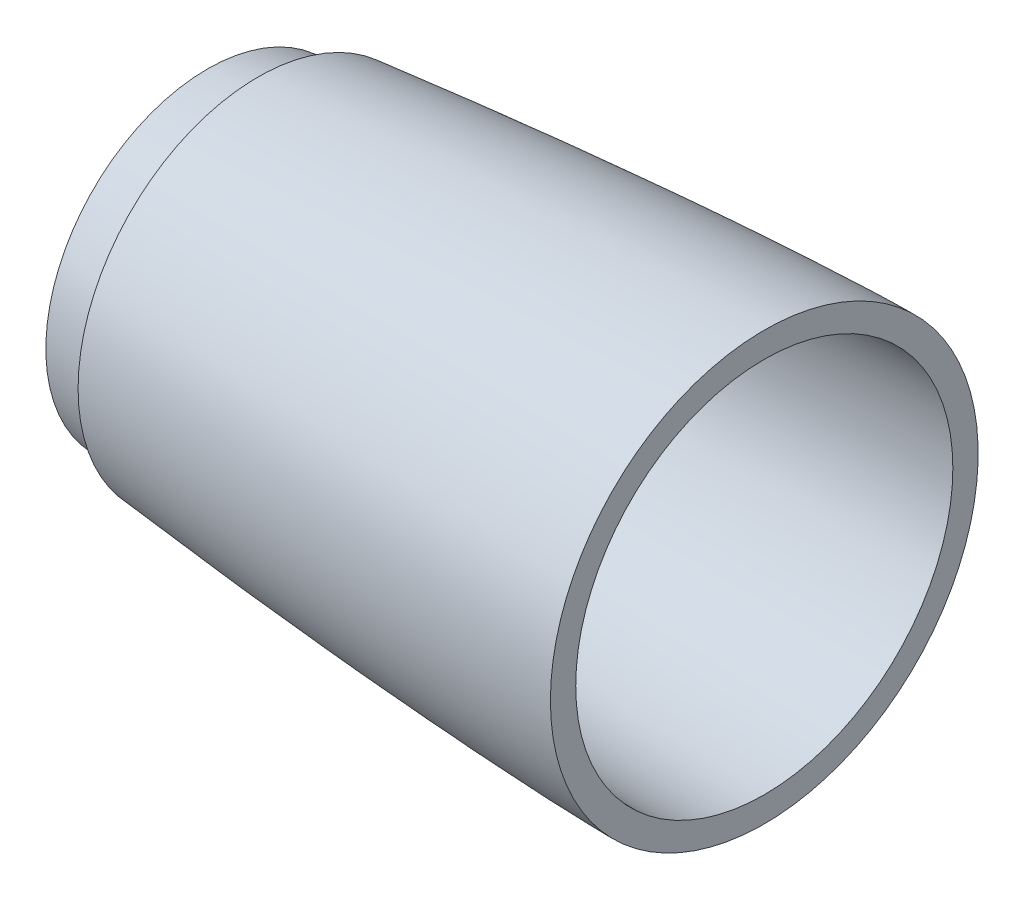
ISO-10303-21;
HEADER;
FILE_DESCRIPTION(('STEP AP214'),'2;1');
FILE_NAME('part.step','',(''),(''),'','','');
FILE_SCHEMA(('AUTOMOTIVE_DESIGN { 1 0 10303 214 1 1 1 1 }'));
ENDSEC;
DATA;
#1=APPLICATION_CONTEXT('core data for automotive mechanical design processes');
#2=APPLICATION_PROTOCOL_DEFINITION('international standard','automotive_design',2000,#1);
#3=PRODUCT_CONTEXT('',#1,'mechanical');
#4=PRODUCT('Part','Part','',(#3));
#5=PRODUCT_RELATED_PRODUCT_CATEGORY('part','',(#4));
#6=PRODUCT_DEFINITION_FORMATION('','',#4);
#7=PRODUCT_DEFINITION_CONTEXT('part definition',#1,'design');
#8=PRODUCT_DEFINITION('design','',#6,#7);
#9=PRODUCT_DEFINITION_SHAPE('','',#8);
#10=(LENGTH_UNIT() NAMED_UNIT(*) SI_UNIT(.MILLI.,.METRE.));
#11=(NAMED_UNIT(*) PLANE_ANGLE_UNIT() SI_UNIT($,.RADIAN.));
#12=(NAMED_UNIT(*) SI_UNIT($,.STERADIAN.) SOLID_ANGLE_UNIT());
#13=UNCERTAINTY_MEASURE_WITH_UNIT(LENGTH_MEASURE(1.E-05),#10,'distance_accuracy_value','');
#14=(GEOMETRIC_REPRESENTATION_CONTEXT(3) GLOBAL_UNCERTAINTY_ASSIGNED_CONTEXT((#13)) GLOBAL_UNIT_ASSIGNED_CONTEXT((#10,
#11,#12)) REPRESENTATION_CONTEXT('',''));
#15=CARTESIAN_POINT('',(0.,0.,0.));
#16=DIRECTION('',(0.,0.,1.));
#17=DIRECTION('',(1.,0.,0.));
#18=AXIS2_PLACEMENT_3D('',#15,#16,#17);
#19=CARTESIAN_POINT('',(379.999999999681,0.,-58.0833991942148));
#20=DIRECTION('',(1.,0.,0.));
#21=DIRECTION('',(0.,0.,-1.));
#22=AXIS2_PLACEMENT_3D('',#19,#20,#21);
#23=PLANE('',#22);
#24=CARTESIAN_POINT('',(380.000000004945,0.,0.964537705785209));
#25=DIRECTION('',(1.,0.,0.));
#26=DIRECTION('',(0.,1.,0.));
#27=AXIS2_PLACEMENT_3D('',#24,#25,#26);
#28=CIRCLE('',#27,63.8479368534603);
#29=CARTESIAN_POINT('',(380.000000004945,63.8479368534603,0.964537705785209));
#30=VERTEX_POINT('',#29);
#31=EDGE_CURVE('E18',#30,#30,#28,.T.);
#32=ORIENTED_EDGE('',*,*,#31,.F.);
#33=EDGE_LOOP('',(#32));
#34=FACE_BOUND('',#33,.T.);
#35=CARTESIAN_POINT('',(379.999999999681,0.,0.964537705785209));
#36=DIRECTION('',(-1.,0.,0.));
#37=DIRECTION('',(0.,0.,1.));
#38=AXIS2_PLACEMENT_3D('',#35,#36,#37);
#39=CIRCLE('',#38,59.0479369);
#40=CARTESIAN_POINT('',(379.999999999681,0.,60.0124746057852));
#41=VERTEX_POINT('',#40);
#42=EDGE_CURVE('E39',#41,#41,#39,.F.);
#43=ORIENTED_EDGE('',*,*,#42,.T.);
#44=EDGE_LOOP('',(#43));
#45=FACE_BOUND('',#44,.T.);
#46=ADVANCED_FACE('F15',(#34,#45),#23,.F.);
#47=CARTESIAN_POINT('',(400.000000006089,0.,0.964537705785209));
#48=DIRECTION('',(1.,0.,0.));
#49=DIRECTION('',(0.,1.,0.));
#50=AXIS2_PLACEMENT_3D('',#47,#48,#49);
#51=CONICAL_SURFACE('',#50,66.1099973006079,0.1126244082);
#52=CARTESIAN_POINT('',(400.000000006089,0.,0.964537705785209));
#53=DIRECTION('',(1.,0.,0.));
#54=DIRECTION('',(0.,1.,0.));
#55=AXIS2_PLACEMENT_3D('',#52,#53,#54);
#56=CIRCLE('',#55,66.1099973006079);
#57=CARTESIAN_POINT('',(400.000000006089,66.1099973006079,0.964537705785209));
#58=VERTEX_POINT('',#57);
#59=EDGE_CURVE('E37',#58,#58,#56,.F.);
#60=ORIENTED_EDGE('',*,*,#59,.T.);
#61=EDGE_LOOP('',(#60));
#62=FACE_BOUND('',#61,.T.);
#63=ORIENTED_EDGE('',*,*,#31,.T.);
#64=EDGE_LOOP('',(#63));
#65=FACE_BOUND('',#64,.T.);
#66=ADVANCED_FACE('F46',(#62,#65),#51,.T.);
#67=CARTESIAN_POINT('',(379.999999999677,0.,-58.0833991942144));
#68=CARTESIAN_POINT('',(381.491572893679,0.,-58.2411280340743));
#69=CARTESIAN_POINT('',(384.504502535526,0.,-58.5578486347942));
#70=CARTESIAN_POINT('',(390.180207109146,0.,-59.1495332991518));
#71=CARTESIAN_POINT('',(396.233334180423,0.,-59.7668903276334));
#72=CARTESIAN_POINT('',(404.723807289305,0.,-60.6219573858539));
#73=CARTESIAN_POINT('',(412.728600218223,0.,-61.4063968825873));
#74=CARTESIAN_POINT('',(421.060003576404,0.,-62.2058637503101));
#75=CARTESIAN_POINT('',(429.20089670457,0.,-62.965362550788));
#76=CARTESIAN_POINT('',(435.802578164731,0.,-63.5703357102628));
#77=CARTESIAN_POINT('',(443.995135831561,0.,-64.3050176574283));
#78=CARTESIAN_POINT('',(453.862494729702,0.,-65.1657429619435));
#79=CARTESIAN_POINT('',(465.356434621266,0.,-66.1311088791061));
#80=CARTESIAN_POINT('',(478.509650312228,0.,-67.1836844487914));
#81=CARTESIAN_POINT('',(491.660017485209,0.,-68.1810878847865));
#82=CARTESIAN_POINT('',(504.818818428607,0.,-69.1216137581801));
#83=CARTESIAN_POINT('',(517.979210866827,0.,-70.0009121546453));
#84=CARTESIAN_POINT('',(529.878728089682,0.,-70.7365156579672));
#85=CARTESIAN_POINT('',(540.134365821878,0.,-71.3216670174386));
#86=CARTESIAN_POINT('',(548.746386587246,0.,-71.7768889943951));
#87=CARTESIAN_POINT('',(555.712770705518,0.,-72.1211154520732));
#88=CARTESIAN_POINT('',(562.301257874866,0.,-72.4240525277916));
#89=CARTESIAN_POINT('',(568.890711851002,0.,-72.7023736585468));
#90=CARTESIAN_POINT('',(575.384815423386,0.,-72.9498993002095));
#91=CARTESIAN_POINT('',(581.330630139149,0.,-73.1492361724911));
#92=CARTESIAN_POINT('',(586.661558241646,0.,-73.3028334136365));
#93=CARTESIAN_POINT('',(591.122153239309,0.,-73.4095382997299));
#94=CARTESIAN_POINT('',(594.570535103073,0.,-73.4761460059192));
#95=CARTESIAN_POINT('',(597.225961659553,0.,-73.5139162474832));
#96=CARTESIAN_POINT('',(598.848795306495,0.,-73.5297362179971));
#97=CARTESIAN_POINT('',(599.694085137108,0.,-73.5336946811012));
#98=CARTESIAN_POINT('',(599.999999999691,0.,-73.5343746076532));
#99=(BOUNDED_CURVE() B_SPLINE_CURVE(4,(#67,#68,#69,#70,#71,#72,#73,#74,#75,#76,#77,#78,#79,#80,
#81,#82,#83,#84,#85,#86,#87,#88,#89,#90,#91,#92,#93,#94,#95,#96,#97,#98),.UNSPECIFIED.,.F.,
.F.) B_SPLINE_CURVE_WITH_KNOTS((5,1,1,1,1,1,1,1,1,1,1,1,1,1,1,1,1,1,1,1,1,1,1,1,1,1,1,1,5),
(0.0903366761135058,0.117532236911604,0.144727797709702,0.171923358279577,0.199118918849453,
0.253510039461756,0.280705600135996,0.307901160810236,0.33509672138002,0.362292281949805,
0.416683402527136,0.471074524071314,0.525465644831659,0.579856766069534,0.634247887068958,
0.68863900810875,0.743030129183897,0.776487138774785,0.803682699157573,0.830878260240666,
0.858073821068272,0.885269381653787,0.912464941735256,0.938067311628474,0.956197685601394,
0.973232305613267,0.986057840316241,0.994954315903573,1.),
.UNSPECIFIED.) CURVE() GEOMETRIC_REPRESENTATION_ITEM() RATIONAL_B_SPLINE_CURVE((1.,1.,1.,1.,1.,
1.,1.,1.,1.,1.,1.,1.,1.,1.,1.,1.,1.,1.,1.,1.,1.,1.,1.,1.,1.,1.,1.,1.,1.,1.,1.,1.)) REPRESENTATION_ITEM(''));
#100=CARTESIAN_POINT('',(379.999999999681,0.,0.964537705785209));
#101=DIRECTION('',(-1.,0.,0.));
#102=AXIS1_PLACEMENT('',#100,#101);
#103=SURFACE_OF_REVOLUTION('',#99,#102);
#104=ORIENTED_EDGE('',*,*,#42,.F.);
#105=EDGE_LOOP('',(#104));
#106=FACE_BOUND('',#105,.T.);
#107=CARTESIAN_POINT('',(600.000000000168,0.,0.964537705785199));
#108=DIRECTION('',(-1.,0.,0.));
#109=DIRECTION('',(0.,0.,1.));
#110=AXIS2_PLACEMENT_3D('',#107,#108,#109);
#111=CIRCLE('',#110,74.4989123134395);
#112=CARTESIAN_POINT('',(600.000000000168,0.,75.4634500192247));
#113=VERTEX_POINT('',#112);
#114=EDGE_CURVE('E27',#113,#113,#111,.F.);
#115=ORIENTED_EDGE('',*,*,#114,.T.);
#116=EDGE_LOOP('',(#115));
#117=FACE_BOUND('',#116,.T.);
#118=ADVANCED_FACE('F53',(#106,#117),#103,.T.);
#119=CARTESIAN_POINT('',(400.000000000714,0.,-70.1454596423442));
#120=DIRECTION('',(1.,0.,0.));
#121=DIRECTION('',(0.,0.,-1.));
#122=AXIS2_PLACEMENT_3D('',#119,#120,#121);
#123=PLANE('',#122);
#124=CARTESIAN_POINT('',(400.000000000714,0.,0.964537705785208));
#125=DIRECTION('',(-1.,0.,0.));
#126=DIRECTION('',(0.,0.,1.));
#127=AXIS2_PLACEMENT_3D('',#124,#125,#126);
#128=CIRCLE('',#127,71.1099973481294);
#129=CARTESIAN_POINT('',(400.000000000714,0.,72.0745350539146));
#130=VERTEX_POINT('',#129);
#131=EDGE_CURVE('E22',#130,#130,#128,.T.);
#132=ORIENTED_EDGE('',*,*,#131,.T.);
#133=EDGE_LOOP('',(#132));
#134=FACE_BOUND('',#133,.T.);
#135=ORIENTED_EDGE('',*,*,#59,.F.);
#136=EDGE_LOOP('',(#135));
#137=FACE_BOUND('',#136,.T.);
#138=ADVANCED_FACE('F63',(#134,#137),#123,.F.);
#139=CARTESIAN_POINT('',(600.000000000168,0.,-83.5343746087498));
#140=DIRECTION('',(-1.,0.,0.));
#141=DIRECTION('',(0.,0.,1.));
#142=AXIS2_PLACEMENT_3D('',#139,#140,#141);
#143=PLANE('',#142);
#144=ORIENTED_EDGE('',*,*,#114,.F.);
#145=EDGE_LOOP('',(#144));
#146=FACE_BOUND('',#145,.T.);
#147=CARTESIAN_POINT('',(600.000000000168,0.,0.964537705785199));
#148=DIRECTION('',(-1.,0.,0.));
#149=DIRECTION('',(0.,0.,1.));
#150=AXIS2_PLACEMENT_3D('',#147,#148,#149);
#151=CIRCLE('',#150,84.498912314321);
#152=CARTESIAN_POINT('',(600.000000000168,0.,85.4634500201062));
#153=VERTEX_POINT('',#152);
#154=EDGE_CURVE('E10',#153,#153,#151,.F.);
#155=ORIENTED_EDGE('',*,*,#154,.T.);
#156=EDGE_LOOP('',(#155));
#157=FACE_BOUND('',#156,.T.);
#158=ADVANCED_FACE('F57',(#146,#157),#143,.F.);
#159=CARTESIAN_POINT('',(599.99999999736,0.,-83.5343746085299));
#160=CARTESIAN_POINT('',(599.727428907774,0.,-83.533801448397));
#161=CARTESIAN_POINT('',(598.965617691932,0.,-83.530430482779));
#162=CARTESIAN_POINT('',(597.495856961293,0.,-83.5168456814021));
#163=CARTESIAN_POINT('',(595.085487544063,0.,-83.4842515009836));
#164=CARTESIAN_POINT('',(591.945106929397,0.,-83.4264872914172));
#165=CARTESIAN_POINT('',(587.905200080394,0.,-83.3343449833436));
#166=CARTESIAN_POINT('',(583.069718535842,0.,-83.2015755440312));
#167=CARTESIAN_POINT('',(577.671655262281,0.,-83.0290895788567));
#168=CARTESIAN_POINT('',(571.773245019036,0.,-82.8147649064522));
#169=CARTESIAN_POINT('',(565.760887077531,0.,-82.5725023347947));
#170=CARTESIAN_POINT('',(559.74932909291,0.,-82.3086802141249));
#171=CARTESIAN_POINT('',(553.545840947679,0.,-82.0160060193716));
#172=CARTESIAN_POINT('',(545.840625395166,0.,-81.6278195992806));
#173=CARTESIAN_POINT('',(536.635401223225,0.,-81.1278033789162));
#174=CARTESIAN_POINT('',(525.929801835726,0.,-80.4981918392373));
#175=CARTESIAN_POINT('',(513.920459860655,0.,-79.7342968596296));
#176=CARTESIAN_POINT('',(501.912200527989,0.,-78.9168506014987));
#177=CARTESIAN_POINT('',(489.911334413755,0.,-78.0497733363368));
#178=CARTESIAN_POINT('',(477.907454897355,0.,-77.1346662658836));
#179=CARTESIAN_POINT('',(467.417634052038,0.,-76.2954405162226));
#180=CARTESIAN_POINT('',(458.411915558024,0.,-75.5472871134485));
#181=CARTESIAN_POINT('',(450.934806983473,0.,-74.908820269482));
#182=CARTESIAN_POINT('',(444.909169087734,0.,-74.383130256516));
#183=CARTESIAN_POINT('',(437.479333373697,0.,-73.7233477869481));
#184=CARTESIAN_POINT('',(429.873981685927,0.,-73.0289186773274));
#185=CARTESIAN_POINT('',(422.568976916987,0.,-72.3479555669862));
#186=CARTESIAN_POINT('',(414.816978809642,0.,-71.6056487257002));
#187=CARTESIAN_POINT('',(409.294523300961,0.,-71.0702451895062));
#188=CARTESIAN_POINT('',(404.111418332143,0.,-70.5568336931938));
#189=CARTESIAN_POINT('',(401.361610203313,0.,-70.282226705394));
#190=CARTESIAN_POINT('',(399.999999997437,0.,-70.145459642015));
#191=(BOUNDED_CURVE() B_SPLINE_CURVE(4,(#159,#160,#161,#162,#163,#164,#165,#166,#167,#168,#169,
#170,#171,#172,#173,#174,#175,#176,#177,#178,#179,#180,#181,#182,#183,#184,#185,#186,#187,#188,
#189,#190),.UNSPECIFIED.,.F.,.F.) B_SPLINE_CURVE_WITH_KNOTS((5,1,1,1,1,1,1,1,1,1,1,1,1,1,1,1,1,
1,1,1,1,1,1,1,1,1,1,1,5),(0.0903099400175364,0.0952566298453185,0.104135625418553,
0.116984496596709,0.134057882801859,0.152258363467516,0.177471873557143,0.204772593298437,
0.232073313247922,0.259374034106257,0.286674755182022,0.313975475064615,0.344782710560595,
0.399384150885421,0.45398559215613,0.508587032448513,0.563188473611224,0.617789914039388,
0.67239135497166,0.726992795743058,0.754293516045177,0.781594236347296,0.808894956957185,
0.836195677567074,0.890797117928663,0.918097838325002,0.94539855872134,0.972699279368899,1.),
.UNSPECIFIED.) CURVE() GEOMETRIC_REPRESENTATION_ITEM() RATIONAL_B_SPLINE_CURVE((1.,1.,1.,1.,1.,
1.,1.,1.,1.,1.,1.,1.,1.,1.,1.,1.,1.,1.,1.,1.,1.,1.,1.,1.,1.,1.,1.,1.,1.,1.,1.,1.)) REPRESENTATION_ITEM(''));
#192=CARTESIAN_POINT('',(379.999999999681,0.,0.964537705785209));
#193=DIRECTION('',(-1.,0.,0.));
#194=AXIS1_PLACEMENT('',#192,#193);
#195=SURFACE_OF_REVOLUTION('',#191,#194);
#196=ORIENTED_EDGE('',*,*,#154,.F.);
#197=EDGE_LOOP('',(#196));
#198=FACE_BOUND('',#197,.T.);
#199=ORIENTED_EDGE('',*,*,#131,.F.);
#200=EDGE_LOOP('',(#199));
#201=FACE_BOUND('',#200,.T.);
#202=ADVANCED_FACE('F55',(#198,#201),#195,.T.);
#203=CLOSED_SHELL('',(#46,#66,#118,#138,#158,#202));
#204=MANIFOLD_SOLID_BREP('B1',#203);
#205=ADVANCED_BREP_SHAPE_REPRESENTATION('',(#18,#204),#14);
#206=SHAPE_DEFINITION_REPRESENTATION(#9,#205);
ENDSEC;
END-ISO-10303-21;
